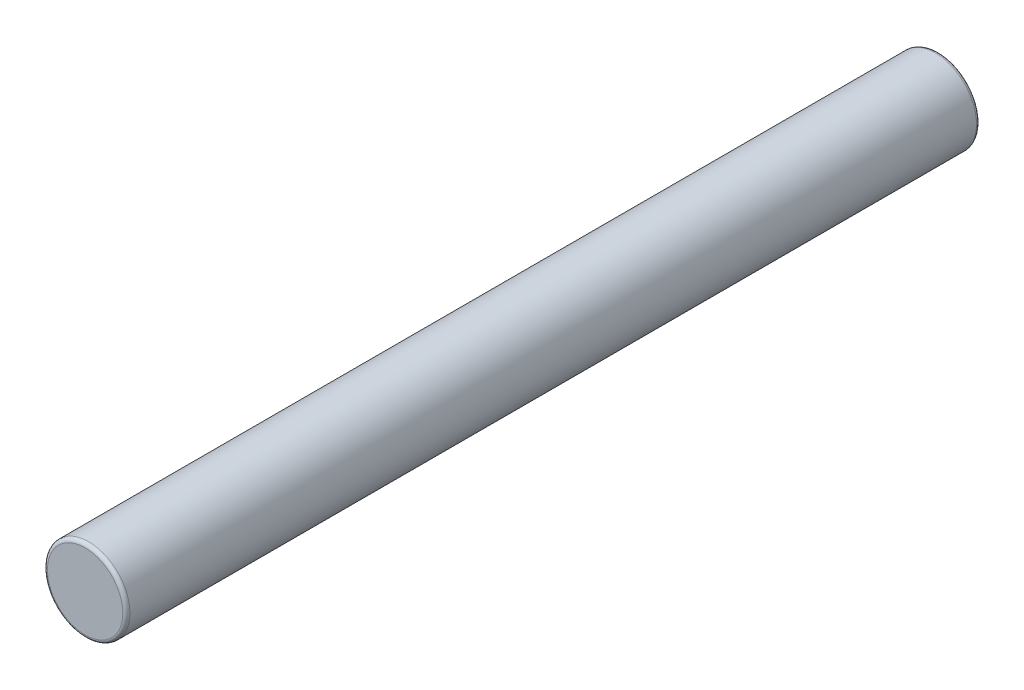
ISO-10303-21;
HEADER;
FILE_DESCRIPTION(('STEP AP214'),'2;1');
FILE_NAME('part.step','',(''),(''),'','','');
FILE_SCHEMA(('AUTOMOTIVE_DESIGN { 1 0 10303 214 1 1 1 1 }'));
ENDSEC;
DATA;
#1=APPLICATION_CONTEXT('core data for automotive mechanical design processes');
#2=APPLICATION_PROTOCOL_DEFINITION('international standard','automotive_design',2000,#1);
#3=PRODUCT_CONTEXT('',#1,'mechanical');
#4=PRODUCT('Part','Part','',(#3));
#5=PRODUCT_RELATED_PRODUCT_CATEGORY('part','',(#4));
#6=PRODUCT_DEFINITION_FORMATION('','',#4);
#7=PRODUCT_DEFINITION_CONTEXT('part definition',#1,'design');
#8=PRODUCT_DEFINITION('design','',#6,#7);
#9=PRODUCT_DEFINITION_SHAPE('','',#8);
#10=(LENGTH_UNIT() NAMED_UNIT(*) SI_UNIT(.MILLI.,.METRE.));
#11=(NAMED_UNIT(*) PLANE_ANGLE_UNIT() SI_UNIT($,.RADIAN.));
#12=(NAMED_UNIT(*) SI_UNIT($,.STERADIAN.) SOLID_ANGLE_UNIT());
#13=UNCERTAINTY_MEASURE_WITH_UNIT(LENGTH_MEASURE(1.E-05),#10,'distance_accuracy_value','');
#14=(GEOMETRIC_REPRESENTATION_CONTEXT(3) GLOBAL_UNCERTAINTY_ASSIGNED_CONTEXT((#13)) GLOBAL_UNIT_ASSIGNED_CONTEXT((#10,
#11,#12)) REPRESENTATION_CONTEXT('',''));
#15=CARTESIAN_POINT('',(0.,0.,0.));
#16=DIRECTION('',(0.,0.,1.));
#17=DIRECTION('',(1.,0.,0.));
#18=AXIS2_PLACEMENT_3D('',#15,#16,#17);
#19=CARTESIAN_POINT('',(0.,0.,60.));
#20=DIRECTION('',(0.,0.,-1.));
#21=DIRECTION('',(-1.,0.,0.));
#22=AXIS2_PLACEMENT_3D('',#19,#20,#21);
#23=CYLINDRICAL_SURFACE('',#22,2.9);
#24=CARTESIAN_POINT('',(0.,0.,59.75));
#25=DIRECTION('',(0.,0.,1.));
#26=DIRECTION('',(1.,0.,0.));
#27=AXIS2_PLACEMENT_3D('',#24,#25,#26);
#28=CIRCLE('',#27,2.9);
#29=CARTESIAN_POINT('',(2.9,0.,59.75));
#30=VERTEX_POINT('',#29);
#31=EDGE_CURVE('E42',#30,#30,#28,.F.);
#32=ORIENTED_EDGE('',*,*,#31,.T.);
#33=EDGE_LOOP('',(#32));
#34=FACE_BOUND('',#33,.T.);
#35=CARTESIAN_POINT('',(0.,0.,0.25));
#36=DIRECTION('',(0.,0.,1.));
#37=DIRECTION('',(1.,0.,0.));
#38=AXIS2_PLACEMENT_3D('',#35,#36,#37);
#39=CIRCLE('',#38,2.9);
#40=CARTESIAN_POINT('',(2.9,0.,0.25));
#41=VERTEX_POINT('',#40);
#42=EDGE_CURVE('E46',#41,#41,#39,.T.);
#43=ORIENTED_EDGE('',*,*,#42,.T.);
#44=EDGE_LOOP('',(#43));
#45=FACE_BOUND('',#44,.T.);
#46=ADVANCED_FACE('F35',(#34,#45),#23,.T.);
#47=CARTESIAN_POINT('',(0.,0.,60.));
#48=DIRECTION('',(0.,0.,1.));
#49=DIRECTION('',(1.,0.,0.));
#50=AXIS2_PLACEMENT_3D('',#47,#48,#49);
#51=PLANE('',#50);
#52=CARTESIAN_POINT('',(0.,0.,60.));
#53=DIRECTION('',(0.,0.,1.));
#54=DIRECTION('',(1.,0.,0.));
#55=AXIS2_PLACEMENT_3D('',#52,#53,#54);
#56=CIRCLE('',#55,2.65);
#57=CARTESIAN_POINT('',(2.65,0.,60.));
#58=VERTEX_POINT('',#57);
#59=EDGE_CURVE('E50',#58,#58,#56,.T.);
#60=ORIENTED_EDGE('',*,*,#59,.T.);
#61=EDGE_LOOP('',(#60));
#62=FACE_BOUND('',#61,.T.);
#63=ADVANCED_FACE('F56',(#62),#51,.T.);
#64=CARTESIAN_POINT('',(0.,0.,0.));
#65=DIRECTION('',(0.,0.,1.));
#66=DIRECTION('',(1.,0.,0.));
#67=AXIS2_PLACEMENT_3D('',#64,#65,#66);
#68=PLANE('',#67);
#69=CARTESIAN_POINT('',(0.,0.,0.));
#70=DIRECTION('',(0.,0.,1.));
#71=DIRECTION('',(1.,0.,0.));
#72=AXIS2_PLACEMENT_3D('',#69,#70,#71);
#73=CIRCLE('',#72,2.65);
#74=CARTESIAN_POINT('',(2.65,0.,0.));
#75=VERTEX_POINT('',#74);
#76=EDGE_CURVE('E10',#75,#75,#73,.F.);
#77=ORIENTED_EDGE('',*,*,#76,.T.);
#78=EDGE_LOOP('',(#77));
#79=FACE_BOUND('',#78,.T.);
#80=ADVANCED_FACE('F60',(#79),#68,.F.);
#81=CARTESIAN_POINT('',(0.,0.,59.75));
#82=DIRECTION('',(0.,0.,1.));
#83=DIRECTION('',(1.,0.,0.));
#84=AXIS2_PLACEMENT_3D('',#81,#82,#83);
#85=TOROIDAL_SURFACE('',#84,2.65,0.25);
#86=ORIENTED_EDGE('',*,*,#31,.F.);
#87=EDGE_LOOP('',(#86));
#88=FACE_BOUND('',#87,.T.);
#89=ORIENTED_EDGE('',*,*,#59,.F.);
#90=EDGE_LOOP('',(#89));
#91=FACE_BOUND('',#90,.T.);
#92=ADVANCED_FACE('F58',(#88,#91),#85,.T.);
#93=CARTESIAN_POINT('',(0.,0.,0.25));
#94=DIRECTION('',(0.,0.,1.));
#95=DIRECTION('',(1.,0.,0.));
#96=AXIS2_PLACEMENT_3D('',#93,#94,#95);
#97=TOROIDAL_SURFACE('',#96,2.65,0.25);
#98=ORIENTED_EDGE('',*,*,#76,.F.);
#99=EDGE_LOOP('',(#98));
#100=FACE_BOUND('',#99,.T.);
#101=ORIENTED_EDGE('',*,*,#42,.F.);
#102=EDGE_LOOP('',(#101));
#103=FACE_BOUND('',#102,.T.);
#104=ADVANCED_FACE('F37',(#100,#103),#97,.T.);
#105=CLOSED_SHELL('',(#46,#63,#80,#92,#104));
#106=MANIFOLD_SOLID_BREP('B2',#105);
#107=ADVANCED_BREP_SHAPE_REPRESENTATION('',(#18,#106),#14);
#108=SHAPE_DEFINITION_REPRESENTATION(#9,#107);
ENDSEC;
END-ISO-10303-21;
